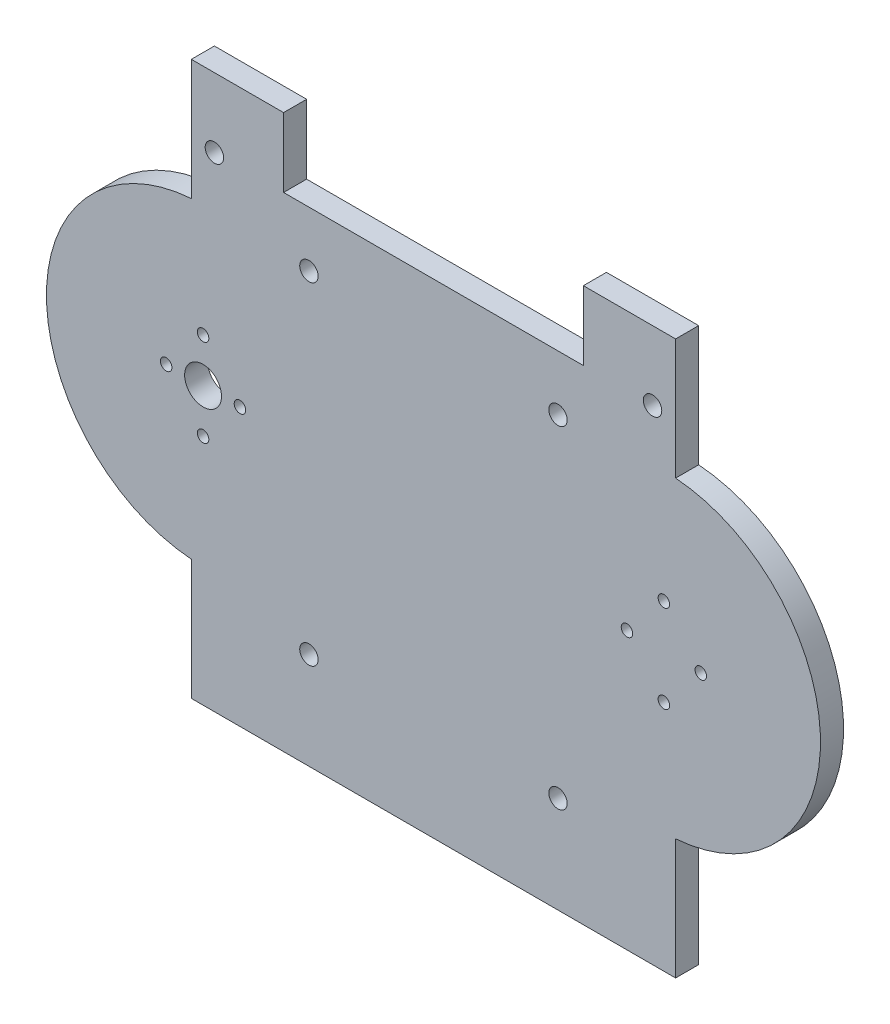
ISO-10303-21;
HEADER;
FILE_DESCRIPTION(('STEP AP214'),'2;1');
FILE_NAME('part.step','',(''),(''),'','','');
FILE_SCHEMA(('AUTOMOTIVE_DESIGN { 1 0 10303 214 1 1 1 1 }'));
ENDSEC;
DATA;
#1=APPLICATION_CONTEXT('core data for automotive mechanical design processes');
#2=APPLICATION_PROTOCOL_DEFINITION('international standard','automotive_design',2000,#1);
#3=PRODUCT_CONTEXT('',#1,'mechanical');
#4=PRODUCT('Part','Part','',(#3));
#5=PRODUCT_RELATED_PRODUCT_CATEGORY('part','',(#4));
#6=PRODUCT_DEFINITION_FORMATION('','',#4);
#7=PRODUCT_DEFINITION_CONTEXT('part definition',#1,'design');
#8=PRODUCT_DEFINITION('design','',#6,#7);
#9=PRODUCT_DEFINITION_SHAPE('','',#8);
#10=(LENGTH_UNIT() NAMED_UNIT(*) SI_UNIT(.MILLI.,.METRE.));
#11=(NAMED_UNIT(*) PLANE_ANGLE_UNIT() SI_UNIT($,.RADIAN.));
#12=(NAMED_UNIT(*) SI_UNIT($,.STERADIAN.) SOLID_ANGLE_UNIT());
#13=UNCERTAINTY_MEASURE_WITH_UNIT(LENGTH_MEASURE(1.E-05),#10,'distance_accuracy_value','');
#14=(GEOMETRIC_REPRESENTATION_CONTEXT(3) GLOBAL_UNCERTAINTY_ASSIGNED_CONTEXT((#13)) GLOBAL_UNIT_ASSIGNED_CONTEXT((#10,
#11,#12)) REPRESENTATION_CONTEXT('',''));
#15=CARTESIAN_POINT('',(0.,0.,0.));
#16=DIRECTION('',(0.,0.,1.));
#17=DIRECTION('',(1.,0.,0.));
#18=AXIS2_PLACEMENT_3D('',#15,#16,#17);
#19=CARTESIAN_POINT('',(-49.95625,0.,5.));
#20=DIRECTION('',(0.,0.,-1.));
#21=DIRECTION('',(-1.,0.,0.));
#22=AXIS2_PLACEMENT_3D('',#19,#20,#21);
#23=CYLINDRICAL_SURFACE('',#22,33.95625);
#24=CARTESIAN_POINT('',(-49.95625,0.,0.));
#25=DIRECTION('',(0.,0.,1.));
#26=DIRECTION('',(1.,0.,0.));
#27=AXIS2_PLACEMENT_3D('',#24,#25,#26);
#28=CIRCLE('',#27,33.95625);
#29=CARTESIAN_POINT('',(-52.5,33.8608365224488,0.));
#30=VERTEX_POINT('',#29);
#31=CARTESIAN_POINT('',(-52.5,-33.8608365224488,0.));
#32=VERTEX_POINT('',#31);
#33=EDGE_CURVE('E229',#30,#32,#28,.T.);
#34=ORIENTED_EDGE('',*,*,#33,.T.);
#35=DIRECTION('',(0.,0.,-1.));
#36=VECTOR('',#35,1.);
#37=CARTESIAN_POINT('',(-52.5,-33.8608365224488,5.));
#38=LINE('',#37,#36);
#39=CARTESIAN_POINT('',(-52.5,-33.8608365224488,5.));
#40=VERTEX_POINT('',#39);
#41=EDGE_CURVE('E11',#40,#32,#38,.T.);
#42=ORIENTED_EDGE('',*,*,#41,.F.);
#43=CARTESIAN_POINT('',(-49.95625,0.,5.));
#44=DIRECTION('',(0.,0.,1.));
#45=DIRECTION('',(1.,0.,0.));
#46=AXIS2_PLACEMENT_3D('',#43,#44,#45);
#47=CIRCLE('',#46,33.95625);
#48=CARTESIAN_POINT('',(-52.5,33.8608365224488,5.));
#49=VERTEX_POINT('',#48);
#50=EDGE_CURVE('E179',#49,#40,#47,.T.);
#51=ORIENTED_EDGE('',*,*,#50,.F.);
#52=DIRECTION('',(0.,0.,-1.));
#53=VECTOR('',#52,1.);
#54=CARTESIAN_POINT('',(-52.5,33.8608365224488,5.));
#55=LINE('',#54,#53);
#56=EDGE_CURVE('E194',#49,#30,#55,.T.);
#57=ORIENTED_EDGE('',*,*,#56,.T.);
#58=EDGE_LOOP('',(#34,#42,#51,#57));
#59=FACE_BOUND('',#58,.T.);
#60=ADVANCED_FACE('F41',(#59),#23,.T.);
#61=CARTESIAN_POINT('',(-52.5,0.,5.));
#62=DIRECTION('',(1.,0.,0.));
#63=DIRECTION('',(0.,1.,0.));
#64=AXIS2_PLACEMENT_3D('',#61,#62,#63);
#65=PLANE('',#64);
#66=DIRECTION('',(0.,-1.,0.));
#67=VECTOR('',#66,1.);
#68=CARTESIAN_POINT('',(-52.5,0.,0.));
#69=LINE('',#68,#67);
#70=CARTESIAN_POINT('',(-52.5,-60.,0.));
#71=VERTEX_POINT('',#70);
#72=EDGE_CURVE('E221',#32,#71,#69,.T.);
#73=ORIENTED_EDGE('',*,*,#72,.T.);
#74=DIRECTION('',(0.,0.,-1.));
#75=VECTOR('',#74,1.);
#76=CARTESIAN_POINT('',(-52.5,-60.,5.));
#77=LINE('',#76,#75);
#78=CARTESIAN_POINT('',(-52.5,-60.,5.));
#79=VERTEX_POINT('',#78);
#80=EDGE_CURVE('E49',#79,#71,#77,.T.);
#81=ORIENTED_EDGE('',*,*,#80,.F.);
#82=DIRECTION('',(0.,-1.,0.));
#83=VECTOR('',#82,1.);
#84=CARTESIAN_POINT('',(-52.5,0.,5.));
#85=LINE('',#84,#83);
#86=EDGE_CURVE('E108',#40,#79,#85,.T.);
#87=ORIENTED_EDGE('',*,*,#86,.F.);
#88=ORIENTED_EDGE('',*,*,#41,.T.);
#89=EDGE_LOOP('',(#73,#81,#87,#88));
#90=FACE_BOUND('',#89,.T.);
#91=ADVANCED_FACE('F308',(#90),#65,.F.);
#92=CARTESIAN_POINT('',(0.,-60.,5.));
#93=DIRECTION('',(0.,1.,0.));
#94=DIRECTION('',(0.,0.,1.));
#95=AXIS2_PLACEMENT_3D('',#92,#93,#94);
#96=PLANE('',#95);
#97=DIRECTION('',(1.,0.,0.));
#98=VECTOR('',#97,1.);
#99=CARTESIAN_POINT('',(0.,-60.,0.));
#100=LINE('',#99,#98);
#101=CARTESIAN_POINT('',(52.5,-60.,0.));
#102=VERTEX_POINT('',#101);
#103=EDGE_CURVE('E215',#71,#102,#100,.T.);
#104=ORIENTED_EDGE('',*,*,#103,.T.);
#105=DIRECTION('',(0.,0.,-1.));
#106=VECTOR('',#105,1.);
#107=CARTESIAN_POINT('',(52.5,-60.,5.));
#108=LINE('',#107,#106);
#109=CARTESIAN_POINT('',(52.5,-60.,5.));
#110=VERTEX_POINT('',#109);
#111=EDGE_CURVE('E209',#110,#102,#108,.T.);
#112=ORIENTED_EDGE('',*,*,#111,.F.);
#113=DIRECTION('',(1.,0.,0.));
#114=VECTOR('',#113,1.);
#115=CARTESIAN_POINT('',(0.,-60.,5.));
#116=LINE('',#115,#114);
#117=EDGE_CURVE('E174',#79,#110,#116,.T.);
#118=ORIENTED_EDGE('',*,*,#117,.F.);
#119=ORIENTED_EDGE('',*,*,#80,.T.);
#120=EDGE_LOOP('',(#104,#112,#118,#119));
#121=FACE_BOUND('',#120,.T.);
#122=ADVANCED_FACE('F214',(#121),#96,.F.);
#123=CARTESIAN_POINT('',(52.5,0.,5.));
#124=DIRECTION('',(1.,0.,0.));
#125=DIRECTION('',(0.,1.,0.));
#126=AXIS2_PLACEMENT_3D('',#123,#124,#125);
#127=PLANE('',#126);
#128=DIRECTION('',(0.,-1.,0.));
#129=VECTOR('',#128,1.);
#130=CARTESIAN_POINT('',(52.5,0.,0.));
#131=LINE('',#130,#129);
#132=CARTESIAN_POINT('',(52.5,-33.8608365224487,0.));
#133=VERTEX_POINT('',#132);
#134=EDGE_CURVE('E224',#133,#102,#131,.T.);
#135=ORIENTED_EDGE('',*,*,#134,.F.);
#136=DIRECTION('',(0.,0.,-1.));
#137=VECTOR('',#136,1.);
#138=CARTESIAN_POINT('',(52.5,-33.8608365224487,5.));
#139=LINE('',#138,#137);
#140=CARTESIAN_POINT('',(52.5,-33.8608365224487,5.));
#141=VERTEX_POINT('',#140);
#142=EDGE_CURVE('E207',#141,#133,#139,.T.);
#143=ORIENTED_EDGE('',*,*,#142,.F.);
#144=DIRECTION('',(0.,-1.,0.));
#145=VECTOR('',#144,1.);
#146=CARTESIAN_POINT('',(52.5,0.,5.));
#147=LINE('',#146,#145);
#148=EDGE_CURVE('E169',#141,#110,#147,.T.);
#149=ORIENTED_EDGE('',*,*,#148,.T.);
#150=ORIENTED_EDGE('',*,*,#111,.T.);
#151=EDGE_LOOP('',(#135,#143,#149,#150));
#152=FACE_BOUND('',#151,.T.);
#153=ADVANCED_FACE('F372',(#152),#127,.T.);
#154=CARTESIAN_POINT('',(49.95625,0.,5.));
#155=DIRECTION('',(0.,0.,-1.));
#156=DIRECTION('',(-1.,0.,0.));
#157=AXIS2_PLACEMENT_3D('',#154,#155,#156);
#158=CYLINDRICAL_SURFACE('',#157,33.95625);
#159=CARTESIAN_POINT('',(49.95625,0.,0.));
#160=DIRECTION('',(0.,0.,1.));
#161=DIRECTION('',(1.,0.,0.));
#162=AXIS2_PLACEMENT_3D('',#159,#160,#161);
#163=CIRCLE('',#162,33.95625);
#164=CARTESIAN_POINT('',(52.5,33.8608365224488,0.));
#165=VERTEX_POINT('',#164);
#166=EDGE_CURVE('E226',#133,#165,#163,.T.);
#167=ORIENTED_EDGE('',*,*,#166,.T.);
#168=DIRECTION('',(0.,0.,-1.));
#169=VECTOR('',#168,1.);
#170=CARTESIAN_POINT('',(52.5,33.8608365224488,5.));
#171=LINE('',#170,#169);
#172=CARTESIAN_POINT('',(52.5,33.8608365224488,5.));
#173=VERTEX_POINT('',#172);
#174=EDGE_CURVE('E205',#173,#165,#171,.T.);
#175=ORIENTED_EDGE('',*,*,#174,.F.);
#176=CARTESIAN_POINT('',(49.95625,0.,5.));
#177=DIRECTION('',(0.,0.,1.));
#178=DIRECTION('',(1.,0.,0.));
#179=AXIS2_PLACEMENT_3D('',#176,#177,#178);
#180=CIRCLE('',#179,33.95625);
#181=EDGE_CURVE('E167',#141,#173,#180,.T.);
#182=ORIENTED_EDGE('',*,*,#181,.F.);
#183=ORIENTED_EDGE('',*,*,#142,.T.);
#184=EDGE_LOOP('',(#167,#175,#182,#183));
#185=FACE_BOUND('',#184,.T.);
#186=ADVANCED_FACE('F374',(#185),#158,.T.);
#187=CARTESIAN_POINT('',(52.5,60.,0.));
#188=VERTEX_POINT('',#187);
#189=EDGE_CURVE('E228',#188,#165,#131,.T.);
#190=ORIENTED_EDGE('',*,*,#189,.F.);
#191=DIRECTION('',(0.,0.,-1.));
#192=VECTOR('',#191,1.);
#193=CARTESIAN_POINT('',(52.5,60.,5.));
#194=LINE('',#193,#192);
#195=CARTESIAN_POINT('',(52.5,60.,5.));
#196=VERTEX_POINT('',#195);
#197=EDGE_CURVE('E203',#196,#188,#194,.T.);
#198=ORIENTED_EDGE('',*,*,#197,.F.);
#199=EDGE_CURVE('E163',#196,#173,#147,.T.);
#200=ORIENTED_EDGE('',*,*,#199,.T.);
#201=ORIENTED_EDGE('',*,*,#174,.T.);
#202=EDGE_LOOP('',(#190,#198,#200,#201));
#203=FACE_BOUND('',#202,.T.);
#204=ADVANCED_FACE('F369',(#203),#127,.T.);
#205=CARTESIAN_POINT('',(0.,60.,5.));
#206=DIRECTION('',(0.,1.,0.));
#207=DIRECTION('',(0.,0.,1.));
#208=AXIS2_PLACEMENT_3D('',#205,#206,#207);
#209=PLANE('',#208);
#210=DIRECTION('',(1.,0.,0.));
#211=VECTOR('',#210,1.);
#212=CARTESIAN_POINT('',(0.,60.,0.));
#213=LINE('',#212,#211);
#214=CARTESIAN_POINT('',(32.5,60.,0.));
#215=VERTEX_POINT('',#214);
#216=EDGE_CURVE('E235',#215,#188,#213,.T.);
#217=ORIENTED_EDGE('',*,*,#216,.F.);
#218=DIRECTION('',(0.,0.,-1.));
#219=VECTOR('',#218,1.);
#220=CARTESIAN_POINT('',(32.5,60.,5.));
#221=LINE('',#220,#219);
#222=CARTESIAN_POINT('',(32.5,60.,5.));
#223=VERTEX_POINT('',#222);
#224=EDGE_CURVE('E201',#223,#215,#221,.T.);
#225=ORIENTED_EDGE('',*,*,#224,.F.);
#226=DIRECTION('',(1.,0.,0.));
#227=VECTOR('',#226,1.);
#228=CARTESIAN_POINT('',(0.,60.,5.));
#229=LINE('',#228,#227);
#230=EDGE_CURVE('E156',#223,#196,#229,.T.);
#231=ORIENTED_EDGE('',*,*,#230,.T.);
#232=ORIENTED_EDGE('',*,*,#197,.T.);
#233=EDGE_LOOP('',(#217,#225,#231,#232));
#234=FACE_BOUND('',#233,.T.);
#235=ADVANCED_FACE('F304',(#234),#209,.T.);
#236=CARTESIAN_POINT('',(32.5,0.,5.));
#237=DIRECTION('',(1.,0.,0.));
#238=DIRECTION('',(0.,0.,-1.));
#239=AXIS2_PLACEMENT_3D('',#236,#237,#238);
#240=PLANE('',#239);
#241=DIRECTION('',(0.,-1.,0.));
#242=VECTOR('',#241,1.);
#243=CARTESIAN_POINT('',(32.5,0.,0.));
#244=LINE('',#243,#242);
#245=CARTESIAN_POINT('',(32.5,45.,0.));
#246=VERTEX_POINT('',#245);
#247=EDGE_CURVE('E238',#215,#246,#244,.T.);
#248=ORIENTED_EDGE('',*,*,#247,.T.);
#249=DIRECTION('',(0.,0.,-1.));
#250=VECTOR('',#249,1.);
#251=CARTESIAN_POINT('',(32.5,45.,5.));
#252=LINE('',#251,#250);
#253=CARTESIAN_POINT('',(32.5,45.,5.));
#254=VERTEX_POINT('',#253);
#255=EDGE_CURVE('E199',#254,#246,#252,.T.);
#256=ORIENTED_EDGE('',*,*,#255,.F.);
#257=DIRECTION('',(0.,-1.,0.));
#258=VECTOR('',#257,1.);
#259=CARTESIAN_POINT('',(32.5,0.,5.));
#260=LINE('',#259,#258);
#261=EDGE_CURVE('E162',#223,#254,#260,.T.);
#262=ORIENTED_EDGE('',*,*,#261,.F.);
#263=ORIENTED_EDGE('',*,*,#224,.T.);
#264=EDGE_LOOP('',(#248,#256,#262,#263));
#265=FACE_BOUND('',#264,.T.);
#266=ADVANCED_FACE('F375',(#265),#240,.F.);
#267=CARTESIAN_POINT('',(0.,45.,5.));
#268=DIRECTION('',(0.,1.,0.));
#269=DIRECTION('',(0.,0.,1.));
#270=AXIS2_PLACEMENT_3D('',#267,#268,#269);
#271=PLANE('',#270);
#272=DIRECTION('',(1.,0.,0.));
#273=VECTOR('',#272,1.);
#274=CARTESIAN_POINT('',(0.,45.,0.));
#275=LINE('',#274,#273);
#276=CARTESIAN_POINT('',(-32.5,45.,0.));
#277=VERTEX_POINT('',#276);
#278=EDGE_CURVE('E242',#277,#246,#275,.T.);
#279=ORIENTED_EDGE('',*,*,#278,.F.);
#280=DIRECTION('',(0.,0.,-1.));
#281=VECTOR('',#280,1.);
#282=CARTESIAN_POINT('',(-32.5,45.,5.));
#283=LINE('',#282,#281);
#284=CARTESIAN_POINT('',(-32.5,45.,5.));
#285=VERTEX_POINT('',#284);
#286=EDGE_CURVE('E145',#285,#277,#283,.T.);
#287=ORIENTED_EDGE('',*,*,#286,.F.);
#288=DIRECTION('',(1.,0.,0.));
#289=VECTOR('',#288,1.);
#290=CARTESIAN_POINT('',(0.,45.,5.));
#291=LINE('',#290,#289);
#292=EDGE_CURVE('E152',#285,#254,#291,.T.);
#293=ORIENTED_EDGE('',*,*,#292,.T.);
#294=ORIENTED_EDGE('',*,*,#255,.T.);
#295=EDGE_LOOP('',(#279,#287,#293,#294));
#296=FACE_BOUND('',#295,.T.);
#297=ADVANCED_FACE('F361',(#296),#271,.T.);
#298=CARTESIAN_POINT('',(-32.5,0.,5.));
#299=DIRECTION('',(1.,0.,0.));
#300=DIRECTION('',(0.,0.,-1.));
#301=AXIS2_PLACEMENT_3D('',#298,#299,#300);
#302=PLANE('',#301);
#303=DIRECTION('',(0.,-1.,0.));
#304=VECTOR('',#303,1.);
#305=CARTESIAN_POINT('',(-32.5,0.,0.));
#306=LINE('',#305,#304);
#307=CARTESIAN_POINT('',(-32.5,60.,0.));
#308=VERTEX_POINT('',#307);
#309=EDGE_CURVE('E140',#308,#277,#306,.T.);
#310=ORIENTED_EDGE('',*,*,#309,.F.);
#311=DIRECTION('',(0.,0.,-1.));
#312=VECTOR('',#311,1.);
#313=CARTESIAN_POINT('',(-32.5,60.,5.));
#314=LINE('',#313,#312);
#315=CARTESIAN_POINT('',(-32.5,60.,5.));
#316=VERTEX_POINT('',#315);
#317=EDGE_CURVE('E135',#316,#308,#314,.T.);
#318=ORIENTED_EDGE('',*,*,#317,.F.);
#319=DIRECTION('',(0.,-1.,0.));
#320=VECTOR('',#319,1.);
#321=CARTESIAN_POINT('',(-32.5,0.,5.));
#322=LINE('',#321,#320);
#323=EDGE_CURVE('E138',#316,#285,#322,.T.);
#324=ORIENTED_EDGE('',*,*,#323,.T.);
#325=ORIENTED_EDGE('',*,*,#286,.T.);
#326=EDGE_LOOP('',(#310,#318,#324,#325));
#327=FACE_BOUND('',#326,.T.);
#328=ADVANCED_FACE('F137',(#327),#302,.T.);
#329=CARTESIAN_POINT('',(-52.5,60.,0.));
#330=VERTEX_POINT('',#329);
#331=EDGE_CURVE('E239',#330,#308,#213,.T.);
#332=ORIENTED_EDGE('',*,*,#331,.F.);
#333=DIRECTION('',(0.,0.,-1.));
#334=VECTOR('',#333,1.);
#335=CARTESIAN_POINT('',(-52.5,60.,5.));
#336=LINE('',#335,#334);
#337=CARTESIAN_POINT('',(-52.5,60.,5.));
#338=VERTEX_POINT('',#337);
#339=EDGE_CURVE('E97',#338,#330,#336,.T.);
#340=ORIENTED_EDGE('',*,*,#339,.F.);
#341=EDGE_CURVE('E150',#338,#316,#229,.T.);
#342=ORIENTED_EDGE('',*,*,#341,.T.);
#343=ORIENTED_EDGE('',*,*,#317,.T.);
#344=EDGE_LOOP('',(#332,#340,#342,#343));
#345=FACE_BOUND('',#344,.T.);
#346=ADVANCED_FACE('F154',(#345),#209,.T.);
#347=CARTESIAN_POINT('',(-57.95625,0.,5.));
#348=DIRECTION('',(0.,0.,-1.));
#349=DIRECTION('',(-1.,0.,0.));
#350=AXIS2_PLACEMENT_3D('',#347,#348,#349);
#351=CYLINDRICAL_SURFACE('',#350,1.25);
#352=CARTESIAN_POINT('',(-57.95625,0.,5.));
#353=DIRECTION('',(0.,0.,1.));
#354=DIRECTION('',(1.,0.,0.));
#355=AXIS2_PLACEMENT_3D('',#352,#353,#354);
#356=CIRCLE('',#355,1.25);
#357=CARTESIAN_POINT('',(-56.70625,0.,5.));
#358=VERTEX_POINT('',#357);
#359=EDGE_CURVE('E319',#358,#358,#356,.T.);
#360=ORIENTED_EDGE('',*,*,#359,.T.);
#361=EDGE_LOOP('',(#360));
#362=FACE_BOUND('',#361,.T.);
#363=CARTESIAN_POINT('',(-57.95625,0.,0.));
#364=DIRECTION('',(0.,0.,1.));
#365=DIRECTION('',(1.,0.,0.));
#366=AXIS2_PLACEMENT_3D('',#363,#364,#365);
#367=CIRCLE('',#366,1.25);
#368=CARTESIAN_POINT('',(-56.70625,0.,0.));
#369=VERTEX_POINT('',#368);
#370=EDGE_CURVE('E185',#369,#369,#367,.T.);
#371=ORIENTED_EDGE('',*,*,#370,.F.);
#372=EDGE_LOOP('',(#371));
#373=FACE_BOUND('',#372,.T.);
#374=ADVANCED_FACE('F292',(#362,#373),#351,.F.);
#375=CARTESIAN_POINT('',(41.95625,0.,5.));
#376=DIRECTION('',(0.,0.,-1.));
#377=DIRECTION('',(-1.,0.,0.));
#378=AXIS2_PLACEMENT_3D('',#375,#376,#377);
#379=CYLINDRICAL_SURFACE('',#378,1.25);
#380=CARTESIAN_POINT('',(41.95625,0.,5.));
#381=DIRECTION('',(0.,0.,1.));
#382=DIRECTION('',(1.,0.,0.));
#383=AXIS2_PLACEMENT_3D('',#380,#381,#382);
#384=CIRCLE('',#383,1.25);
#385=CARTESIAN_POINT('',(43.20625,0.,5.));
#386=VERTEX_POINT('',#385);
#387=EDGE_CURVE('E321',#386,#386,#384,.F.);
#388=ORIENTED_EDGE('',*,*,#387,.F.);
#389=EDGE_LOOP('',(#388));
#390=FACE_BOUND('',#389,.T.);
#391=CARTESIAN_POINT('',(41.95625,0.,0.));
#392=DIRECTION('',(0.,0.,1.));
#393=DIRECTION('',(1.,0.,0.));
#394=AXIS2_PLACEMENT_3D('',#391,#392,#393);
#395=CIRCLE('',#394,1.25);
#396=CARTESIAN_POINT('',(43.20625,0.,0.));
#397=VERTEX_POINT('',#396);
#398=EDGE_CURVE('E190',#397,#397,#395,.F.);
#399=ORIENTED_EDGE('',*,*,#398,.T.);
#400=EDGE_LOOP('',(#399));
#401=FACE_BOUND('',#400,.T.);
#402=ADVANCED_FACE('F284',(#390,#401),#379,.F.);
#403=CARTESIAN_POINT('',(49.95625,9.5,5.));
#404=DIRECTION('',(0.,0.,-1.));
#405=DIRECTION('',(-1.,0.,0.));
#406=AXIS2_PLACEMENT_3D('',#403,#404,#405);
#407=CYLINDRICAL_SURFACE('',#406,1.25);
#408=CARTESIAN_POINT('',(49.95625,9.5,5.));
#409=DIRECTION('',(0.,0.,1.));
#410=DIRECTION('',(1.,0.,0.));
#411=AXIS2_PLACEMENT_3D('',#408,#409,#410);
#412=CIRCLE('',#411,1.25);
#413=CARTESIAN_POINT('',(51.20625,9.5,5.));
#414=VERTEX_POINT('',#413);
#415=EDGE_CURVE('E324',#414,#414,#412,.F.);
#416=ORIENTED_EDGE('',*,*,#415,.F.);
#417=EDGE_LOOP('',(#416));
#418=FACE_BOUND('',#417,.T.);
#419=CARTESIAN_POINT('',(49.95625,9.5,0.));
#420=DIRECTION('',(0.,0.,1.));
#421=DIRECTION('',(1.,0.,0.));
#422=AXIS2_PLACEMENT_3D('',#419,#420,#421);
#423=CIRCLE('',#422,1.25);
#424=CARTESIAN_POINT('',(51.20625,9.5,0.));
#425=VERTEX_POINT('',#424);
#426=EDGE_CURVE('E279',#425,#425,#423,.F.);
#427=ORIENTED_EDGE('',*,*,#426,.T.);
#428=EDGE_LOOP('',(#427));
#429=FACE_BOUND('',#428,.T.);
#430=ADVANCED_FACE('F300',(#418,#429),#407,.F.);
#431=CARTESIAN_POINT('',(49.95625,-9.5,5.));
#432=DIRECTION('',(0.,0.,-1.));
#433=DIRECTION('',(-1.,0.,0.));
#434=AXIS2_PLACEMENT_3D('',#431,#432,#433);
#435=CYLINDRICAL_SURFACE('',#434,1.25);
#436=CARTESIAN_POINT('',(49.95625,-9.5,5.));
#437=DIRECTION('',(0.,0.,1.));
#438=DIRECTION('',(1.,0.,0.));
#439=AXIS2_PLACEMENT_3D('',#436,#437,#438);
#440=CIRCLE('',#439,1.25);
#441=CARTESIAN_POINT('',(51.20625,-9.5,5.));
#442=VERTEX_POINT('',#441);
#443=EDGE_CURVE('E327',#442,#442,#440,.F.);
#444=ORIENTED_EDGE('',*,*,#443,.F.);
#445=EDGE_LOOP('',(#444));
#446=FACE_BOUND('',#445,.T.);
#447=CARTESIAN_POINT('',(49.95625,-9.5,0.));
#448=DIRECTION('',(0.,0.,1.));
#449=DIRECTION('',(1.,0.,0.));
#450=AXIS2_PLACEMENT_3D('',#447,#448,#449);
#451=CIRCLE('',#450,1.25);
#452=CARTESIAN_POINT('',(51.20625,-9.5,0.));
#453=VERTEX_POINT('',#452);
#454=EDGE_CURVE('E276',#453,#453,#451,.F.);
#455=ORIENTED_EDGE('',*,*,#454,.T.);
#456=EDGE_LOOP('',(#455));
#457=FACE_BOUND('',#456,.T.);
#458=ADVANCED_FACE('F452',(#446,#457),#435,.F.);
#459=CARTESIAN_POINT('',(-49.95625,9.5,5.));
#460=DIRECTION('',(0.,0.,-1.));
#461=DIRECTION('',(-1.,0.,0.));
#462=AXIS2_PLACEMENT_3D('',#459,#460,#461);
#463=CYLINDRICAL_SURFACE('',#462,1.25);
#464=CARTESIAN_POINT('',(-49.95625,9.5,5.));
#465=DIRECTION('',(0.,0.,1.));
#466=DIRECTION('',(1.,0.,0.));
#467=AXIS2_PLACEMENT_3D('',#464,#465,#466);
#468=CIRCLE('',#467,1.25);
#469=CARTESIAN_POINT('',(-48.70625,9.5,5.));
#470=VERTEX_POINT('',#469);
#471=EDGE_CURVE('E330',#470,#470,#468,.T.);
#472=ORIENTED_EDGE('',*,*,#471,.T.);
#473=EDGE_LOOP('',(#472));
#474=FACE_BOUND('',#473,.T.);
#475=CARTESIAN_POINT('',(-49.95625,9.5,0.));
#476=DIRECTION('',(0.,0.,1.));
#477=DIRECTION('',(1.,0.,0.));
#478=AXIS2_PLACEMENT_3D('',#475,#476,#477);
#479=CIRCLE('',#478,1.25);
#480=CARTESIAN_POINT('',(-48.70625,9.5,0.));
#481=VERTEX_POINT('',#480);
#482=EDGE_CURVE('E273',#481,#481,#479,.T.);
#483=ORIENTED_EDGE('',*,*,#482,.F.);
#484=EDGE_LOOP('',(#483));
#485=FACE_BOUND('',#484,.T.);
#486=ADVANCED_FACE('F462',(#474,#485),#463,.F.);
#487=CARTESIAN_POINT('',(-41.95625,0.,5.));
#488=DIRECTION('',(0.,0.,-1.));
#489=DIRECTION('',(-1.,0.,0.));
#490=AXIS2_PLACEMENT_3D('',#487,#488,#489);
#491=CYLINDRICAL_SURFACE('',#490,1.25);
#492=CARTESIAN_POINT('',(-41.95625,0.,5.));
#493=DIRECTION('',(0.,0.,1.));
#494=DIRECTION('',(1.,0.,0.));
#495=AXIS2_PLACEMENT_3D('',#492,#493,#494);
#496=CIRCLE('',#495,1.25);
#497=CARTESIAN_POINT('',(-40.70625,0.,5.));
#498=VERTEX_POINT('',#497);
#499=EDGE_CURVE('E333',#498,#498,#496,.T.);
#500=ORIENTED_EDGE('',*,*,#499,.T.);
#501=EDGE_LOOP('',(#500));
#502=FACE_BOUND('',#501,.T.);
#503=CARTESIAN_POINT('',(-41.95625,0.,0.));
#504=DIRECTION('',(0.,0.,1.));
#505=DIRECTION('',(1.,0.,0.));
#506=AXIS2_PLACEMENT_3D('',#503,#504,#505);
#507=CIRCLE('',#506,1.25);
#508=CARTESIAN_POINT('',(-40.70625,0.,0.));
#509=VERTEX_POINT('',#508);
#510=EDGE_CURVE('E270',#509,#509,#507,.T.);
#511=ORIENTED_EDGE('',*,*,#510,.F.);
#512=EDGE_LOOP('',(#511));
#513=FACE_BOUND('',#512,.T.);
#514=ADVANCED_FACE('F472',(#502,#513),#491,.F.);
#515=CARTESIAN_POINT('',(-49.95625,-9.5,5.));
#516=DIRECTION('',(0.,0.,-1.));
#517=DIRECTION('',(-1.,0.,0.));
#518=AXIS2_PLACEMENT_3D('',#515,#516,#517);
#519=CYLINDRICAL_SURFACE('',#518,1.25);
#520=CARTESIAN_POINT('',(-49.95625,-9.5,5.));
#521=DIRECTION('',(0.,0.,1.));
#522=DIRECTION('',(1.,0.,0.));
#523=AXIS2_PLACEMENT_3D('',#520,#521,#522);
#524=CIRCLE('',#523,1.25);
#525=CARTESIAN_POINT('',(-48.70625,-9.5,5.));
#526=VERTEX_POINT('',#525);
#527=EDGE_CURVE('E336',#526,#526,#524,.T.);
#528=ORIENTED_EDGE('',*,*,#527,.T.);
#529=EDGE_LOOP('',(#528));
#530=FACE_BOUND('',#529,.T.);
#531=CARTESIAN_POINT('',(-49.95625,-9.5,0.));
#532=DIRECTION('',(0.,0.,1.));
#533=DIRECTION('',(1.,0.,0.));
#534=AXIS2_PLACEMENT_3D('',#531,#532,#533);
#535=CIRCLE('',#534,1.25);
#536=CARTESIAN_POINT('',(-48.70625,-9.5,0.));
#537=VERTEX_POINT('',#536);
#538=EDGE_CURVE('E267',#537,#537,#535,.T.);
#539=ORIENTED_EDGE('',*,*,#538,.F.);
#540=EDGE_LOOP('',(#539));
#541=FACE_BOUND('',#540,.T.);
#542=ADVANCED_FACE('F482',(#530,#541),#519,.F.);
#543=CARTESIAN_POINT('',(-27.,-39.,5.));
#544=DIRECTION('',(0.,0.,-1.));
#545=DIRECTION('',(-1.,0.,0.));
#546=AXIS2_PLACEMENT_3D('',#543,#544,#545);
#547=CYLINDRICAL_SURFACE('',#546,2.);
#548=CARTESIAN_POINT('',(-27.,-39.,5.));
#549=DIRECTION('',(0.,0.,1.));
#550=DIRECTION('',(1.,0.,0.));
#551=AXIS2_PLACEMENT_3D('',#548,#549,#550);
#552=CIRCLE('',#551,2.);
#553=CARTESIAN_POINT('',(-25.,-39.,5.));
#554=VERTEX_POINT('',#553);
#555=EDGE_CURVE('E339',#554,#554,#552,.T.);
#556=ORIENTED_EDGE('',*,*,#555,.T.);
#557=EDGE_LOOP('',(#556));
#558=FACE_BOUND('',#557,.T.);
#559=CARTESIAN_POINT('',(-27.,-39.,0.));
#560=DIRECTION('',(0.,0.,1.));
#561=DIRECTION('',(1.,0.,0.));
#562=AXIS2_PLACEMENT_3D('',#559,#560,#561);
#563=CIRCLE('',#562,2.);
#564=CARTESIAN_POINT('',(-25.,-39.,0.));
#565=VERTEX_POINT('',#564);
#566=EDGE_CURVE('E264',#565,#565,#563,.T.);
#567=ORIENTED_EDGE('',*,*,#566,.F.);
#568=EDGE_LOOP('',(#567));
#569=FACE_BOUND('',#568,.T.);
#570=ADVANCED_FACE('F492',(#558,#569),#547,.F.);
#571=CARTESIAN_POINT('',(27.,-39.,5.));
#572=DIRECTION('',(0.,0.,-1.));
#573=DIRECTION('',(-1.,0.,0.));
#574=AXIS2_PLACEMENT_3D('',#571,#572,#573);
#575=CYLINDRICAL_SURFACE('',#574,2.);
#576=CARTESIAN_POINT('',(27.,-39.,5.));
#577=DIRECTION('',(0.,0.,1.));
#578=DIRECTION('',(1.,0.,0.));
#579=AXIS2_PLACEMENT_3D('',#576,#577,#578);
#580=CIRCLE('',#579,2.);
#581=CARTESIAN_POINT('',(29.,-39.,5.));
#582=VERTEX_POINT('',#581);
#583=EDGE_CURVE('E342',#582,#582,#580,.T.);
#584=ORIENTED_EDGE('',*,*,#583,.T.);
#585=EDGE_LOOP('',(#584));
#586=FACE_BOUND('',#585,.T.);
#587=CARTESIAN_POINT('',(27.,-39.,0.));
#588=DIRECTION('',(0.,0.,1.));
#589=DIRECTION('',(1.,0.,0.));
#590=AXIS2_PLACEMENT_3D('',#587,#588,#589);
#591=CIRCLE('',#590,2.);
#592=CARTESIAN_POINT('',(29.,-39.,0.));
#593=VERTEX_POINT('',#592);
#594=EDGE_CURVE('E261',#593,#593,#591,.T.);
#595=ORIENTED_EDGE('',*,*,#594,.F.);
#596=EDGE_LOOP('',(#595));
#597=FACE_BOUND('',#596,.T.);
#598=ADVANCED_FACE('F502',(#586,#597),#575,.F.);
#599=CARTESIAN_POINT('',(27.,33.,5.));
#600=DIRECTION('',(0.,0.,-1.));
#601=DIRECTION('',(-1.,0.,0.));
#602=AXIS2_PLACEMENT_3D('',#599,#600,#601);
#603=CYLINDRICAL_SURFACE('',#602,2.);
#604=CARTESIAN_POINT('',(27.,33.,5.));
#605=DIRECTION('',(0.,0.,1.));
#606=DIRECTION('',(1.,0.,0.));
#607=AXIS2_PLACEMENT_3D('',#604,#605,#606);
#608=CIRCLE('',#607,2.);
#609=CARTESIAN_POINT('',(29.,33.,5.));
#610=VERTEX_POINT('',#609);
#611=EDGE_CURVE('E345',#610,#610,#608,.T.);
#612=ORIENTED_EDGE('',*,*,#611,.T.);
#613=EDGE_LOOP('',(#612));
#614=FACE_BOUND('',#613,.T.);
#615=CARTESIAN_POINT('',(27.,33.,0.));
#616=DIRECTION('',(0.,0.,1.));
#617=DIRECTION('',(1.,0.,0.));
#618=AXIS2_PLACEMENT_3D('',#615,#616,#617);
#619=CIRCLE('',#618,2.);
#620=CARTESIAN_POINT('',(29.,33.,0.));
#621=VERTEX_POINT('',#620);
#622=EDGE_CURVE('E258',#621,#621,#619,.T.);
#623=ORIENTED_EDGE('',*,*,#622,.F.);
#624=EDGE_LOOP('',(#623));
#625=FACE_BOUND('',#624,.T.);
#626=ADVANCED_FACE('F512',(#614,#625),#603,.F.);
#627=CARTESIAN_POINT('',(-27.,33.,5.));
#628=DIRECTION('',(0.,0.,-1.));
#629=DIRECTION('',(-1.,0.,0.));
#630=AXIS2_PLACEMENT_3D('',#627,#628,#629);
#631=CYLINDRICAL_SURFACE('',#630,2.);
#632=CARTESIAN_POINT('',(-27.,33.,5.));
#633=DIRECTION('',(0.,0.,1.));
#634=DIRECTION('',(1.,0.,0.));
#635=AXIS2_PLACEMENT_3D('',#632,#633,#634);
#636=CIRCLE('',#635,2.);
#637=CARTESIAN_POINT('',(-25.,33.,5.));
#638=VERTEX_POINT('',#637);
#639=EDGE_CURVE('E348',#638,#638,#636,.T.);
#640=ORIENTED_EDGE('',*,*,#639,.T.);
#641=EDGE_LOOP('',(#640));
#642=FACE_BOUND('',#641,.T.);
#643=CARTESIAN_POINT('',(-27.,33.,0.));
#644=DIRECTION('',(0.,0.,1.));
#645=DIRECTION('',(1.,0.,0.));
#646=AXIS2_PLACEMENT_3D('',#643,#644,#645);
#647=CIRCLE('',#646,2.);
#648=CARTESIAN_POINT('',(-25.,33.,0.));
#649=VERTEX_POINT('',#648);
#650=EDGE_CURVE('E255',#649,#649,#647,.T.);
#651=ORIENTED_EDGE('',*,*,#650,.F.);
#652=EDGE_LOOP('',(#651));
#653=FACE_BOUND('',#652,.T.);
#654=ADVANCED_FACE('F522',(#642,#653),#631,.F.);
#655=CARTESIAN_POINT('',(47.5,45.,5.));
#656=DIRECTION('',(0.,0.,-1.));
#657=DIRECTION('',(-1.,0.,0.));
#658=AXIS2_PLACEMENT_3D('',#655,#656,#657);
#659=CYLINDRICAL_SURFACE('',#658,2.);
#660=CARTESIAN_POINT('',(47.5,45.,5.));
#661=DIRECTION('',(0.,0.,1.));
#662=DIRECTION('',(1.,0.,0.));
#663=AXIS2_PLACEMENT_3D('',#660,#661,#662);
#664=CIRCLE('',#663,2.);
#665=CARTESIAN_POINT('',(49.5,45.,5.));
#666=VERTEX_POINT('',#665);
#667=EDGE_CURVE('E351',#666,#666,#664,.T.);
#668=ORIENTED_EDGE('',*,*,#667,.T.);
#669=EDGE_LOOP('',(#668));
#670=FACE_BOUND('',#669,.T.);
#671=CARTESIAN_POINT('',(47.5,45.,0.));
#672=DIRECTION('',(0.,0.,1.));
#673=DIRECTION('',(1.,0.,0.));
#674=AXIS2_PLACEMENT_3D('',#671,#672,#673);
#675=CIRCLE('',#674,2.);
#676=CARTESIAN_POINT('',(49.5,45.,0.));
#677=VERTEX_POINT('',#676);
#678=EDGE_CURVE('E252',#677,#677,#675,.T.);
#679=ORIENTED_EDGE('',*,*,#678,.F.);
#680=EDGE_LOOP('',(#679));
#681=FACE_BOUND('',#680,.T.);
#682=ADVANCED_FACE('F532',(#670,#681),#659,.F.);
#683=CARTESIAN_POINT('',(-47.5,45.,5.));
#684=DIRECTION('',(0.,0.,-1.));
#685=DIRECTION('',(-1.,0.,0.));
#686=AXIS2_PLACEMENT_3D('',#683,#684,#685);
#687=CYLINDRICAL_SURFACE('',#686,2.);
#688=CARTESIAN_POINT('',(-47.5,45.,5.));
#689=DIRECTION('',(0.,0.,1.));
#690=DIRECTION('',(1.,0.,0.));
#691=AXIS2_PLACEMENT_3D('',#688,#689,#690);
#692=CIRCLE('',#691,2.);
#693=CARTESIAN_POINT('',(-45.5,45.,5.));
#694=VERTEX_POINT('',#693);
#695=EDGE_CURVE('E354',#694,#694,#692,.T.);
#696=ORIENTED_EDGE('',*,*,#695,.T.);
#697=EDGE_LOOP('',(#696));
#698=FACE_BOUND('',#697,.T.);
#699=CARTESIAN_POINT('',(-47.5,45.,0.));
#700=DIRECTION('',(0.,0.,1.));
#701=DIRECTION('',(1.,0.,0.));
#702=AXIS2_PLACEMENT_3D('',#699,#700,#701);
#703=CIRCLE('',#702,2.);
#704=CARTESIAN_POINT('',(-45.5,45.,0.));
#705=VERTEX_POINT('',#704);
#706=EDGE_CURVE('E249',#705,#705,#703,.T.);
#707=ORIENTED_EDGE('',*,*,#706,.F.);
#708=EDGE_LOOP('',(#707));
#709=FACE_BOUND('',#708,.T.);
#710=ADVANCED_FACE('F542',(#698,#709),#687,.F.);
#711=CARTESIAN_POINT('',(-49.95625,0.,5.));
#712=DIRECTION('',(0.,0.,-1.));
#713=DIRECTION('',(-1.,0.,0.));
#714=AXIS2_PLACEMENT_3D('',#711,#712,#713);
#715=CYLINDRICAL_SURFACE('',#714,4.00000000000001);
#716=CARTESIAN_POINT('',(-49.95625,0.,5.));
#717=DIRECTION('',(0.,0.,1.));
#718=DIRECTION('',(1.,0.,0.));
#719=AXIS2_PLACEMENT_3D('',#716,#717,#718);
#720=CIRCLE('',#719,4.00000000000001);
#721=CARTESIAN_POINT('',(-45.95625,0.,5.));
#722=VERTEX_POINT('',#721);
#723=EDGE_CURVE('E157',#722,#722,#720,.T.);
#724=ORIENTED_EDGE('',*,*,#723,.T.);
#725=EDGE_LOOP('',(#724));
#726=FACE_BOUND('',#725,.T.);
#727=CARTESIAN_POINT('',(-49.95625,0.,0.));
#728=DIRECTION('',(0.,0.,1.));
#729=DIRECTION('',(1.,0.,0.));
#730=AXIS2_PLACEMENT_3D('',#727,#728,#729);
#731=CIRCLE('',#730,4.00000000000001);
#732=CARTESIAN_POINT('',(-45.95625,0.,0.));
#733=VERTEX_POINT('',#732);
#734=EDGE_CURVE('E246',#733,#733,#731,.T.);
#735=ORIENTED_EDGE('',*,*,#734,.F.);
#736=EDGE_LOOP('',(#735));
#737=FACE_BOUND('',#736,.T.);
#738=ADVANCED_FACE('F552',(#726,#737),#715,.F.);
#739=EDGE_CURVE('E100',#330,#30,#69,.T.);
#740=ORIENTED_EDGE('',*,*,#739,.T.);
#741=ORIENTED_EDGE('',*,*,#56,.F.);
#742=EDGE_CURVE('E57',#338,#49,#85,.T.);
#743=ORIENTED_EDGE('',*,*,#742,.F.);
#744=ORIENTED_EDGE('',*,*,#339,.T.);
#745=EDGE_LOOP('',(#740,#741,#743,#744));
#746=FACE_BOUND('',#745,.T.);
#747=ADVANCED_FACE('F314',(#746),#65,.F.);
#748=CARTESIAN_POINT('',(57.95625,0.,5.));
#749=DIRECTION('',(0.,0.,-1.));
#750=DIRECTION('',(-1.,0.,0.));
#751=AXIS2_PLACEMENT_3D('',#748,#749,#750);
#752=CYLINDRICAL_SURFACE('',#751,1.25);
#753=CARTESIAN_POINT('',(57.95625,0.,5.));
#754=DIRECTION('',(0.,0.,1.));
#755=DIRECTION('',(1.,0.,0.));
#756=AXIS2_PLACEMENT_3D('',#753,#754,#755);
#757=CIRCLE('',#756,1.25);
#758=CARTESIAN_POINT('',(59.20625,0.,5.));
#759=VERTEX_POINT('',#758);
#760=EDGE_CURVE('E196',#759,#759,#757,.F.);
#761=ORIENTED_EDGE('',*,*,#760,.F.);
#762=EDGE_LOOP('',(#761));
#763=FACE_BOUND('',#762,.T.);
#764=CARTESIAN_POINT('',(57.95625,0.,0.));
#765=DIRECTION('',(0.,0.,1.));
#766=DIRECTION('',(1.,0.,0.));
#767=AXIS2_PLACEMENT_3D('',#764,#765,#766);
#768=CIRCLE('',#767,1.25);
#769=CARTESIAN_POINT('',(59.20625,0.,0.));
#770=VERTEX_POINT('',#769);
#771=EDGE_CURVE('E181',#770,#770,#768,.F.);
#772=ORIENTED_EDGE('',*,*,#771,.T.);
#773=EDGE_LOOP('',(#772));
#774=FACE_BOUND('',#773,.T.);
#775=ADVANCED_FACE('F571',(#763,#774),#752,.F.);
#776=CARTESIAN_POINT('',(0.,0.,5.));
#777=DIRECTION('',(0.,0.,1.));
#778=DIRECTION('',(1.,0.,0.));
#779=AXIS2_PLACEMENT_3D('',#776,#777,#778);
#780=PLANE('',#779);
#781=ORIENTED_EDGE('',*,*,#50,.T.);
#782=ORIENTED_EDGE('',*,*,#86,.T.);
#783=ORIENTED_EDGE('',*,*,#117,.T.);
#784=ORIENTED_EDGE('',*,*,#148,.F.);
#785=ORIENTED_EDGE('',*,*,#181,.T.);
#786=ORIENTED_EDGE('',*,*,#199,.F.);
#787=ORIENTED_EDGE('',*,*,#230,.F.);
#788=ORIENTED_EDGE('',*,*,#261,.T.);
#789=ORIENTED_EDGE('',*,*,#292,.F.);
#790=ORIENTED_EDGE('',*,*,#323,.F.);
#791=ORIENTED_EDGE('',*,*,#341,.F.);
#792=ORIENTED_EDGE('',*,*,#742,.T.);
#793=EDGE_LOOP('',(#781,#782,#783,#784,#785,#786,#787,#788,#789,#790,#791,#792));
#794=FACE_BOUND('',#793,.T.);
#795=ORIENTED_EDGE('',*,*,#723,.F.);
#796=EDGE_LOOP('',(#795));
#797=FACE_BOUND('',#796,.T.);
#798=ORIENTED_EDGE('',*,*,#695,.F.);
#799=EDGE_LOOP('',(#798));
#800=FACE_BOUND('',#799,.T.);
#801=ORIENTED_EDGE('',*,*,#667,.F.);
#802=EDGE_LOOP('',(#801));
#803=FACE_BOUND('',#802,.T.);
#804=ORIENTED_EDGE('',*,*,#639,.F.);
#805=EDGE_LOOP('',(#804));
#806=FACE_BOUND('',#805,.T.);
#807=ORIENTED_EDGE('',*,*,#611,.F.);
#808=EDGE_LOOP('',(#807));
#809=FACE_BOUND('',#808,.T.);
#810=ORIENTED_EDGE('',*,*,#583,.F.);
#811=EDGE_LOOP('',(#810));
#812=FACE_BOUND('',#811,.T.);
#813=ORIENTED_EDGE('',*,*,#555,.F.);
#814=EDGE_LOOP('',(#813));
#815=FACE_BOUND('',#814,.T.);
#816=ORIENTED_EDGE('',*,*,#527,.F.);
#817=EDGE_LOOP('',(#816));
#818=FACE_BOUND('',#817,.T.);
#819=ORIENTED_EDGE('',*,*,#499,.F.);
#820=EDGE_LOOP('',(#819));
#821=FACE_BOUND('',#820,.T.);
#822=ORIENTED_EDGE('',*,*,#471,.F.);
#823=EDGE_LOOP('',(#822));
#824=FACE_BOUND('',#823,.T.);
#825=ORIENTED_EDGE('',*,*,#443,.T.);
#826=EDGE_LOOP('',(#825));
#827=FACE_BOUND('',#826,.T.);
#828=ORIENTED_EDGE('',*,*,#415,.T.);
#829=EDGE_LOOP('',(#828));
#830=FACE_BOUND('',#829,.T.);
#831=ORIENTED_EDGE('',*,*,#387,.T.);
#832=EDGE_LOOP('',(#831));
#833=FACE_BOUND('',#832,.T.);
#834=ORIENTED_EDGE('',*,*,#359,.F.);
#835=EDGE_LOOP('',(#834));
#836=FACE_BOUND('',#835,.T.);
#837=ORIENTED_EDGE('',*,*,#760,.T.);
#838=EDGE_LOOP('',(#837));
#839=FACE_BOUND('',#838,.T.);
#840=ADVANCED_FACE('F148',(#794,#797,#800,#803,#806,#809,#812,#815,#818,#821,#824,#827,#830,
#833,#836,#839),#780,.T.);
#841=CARTESIAN_POINT('',(0.,0.,0.));
#842=DIRECTION('',(0.,0.,1.));
#843=DIRECTION('',(1.,0.,0.));
#844=AXIS2_PLACEMENT_3D('',#841,#842,#843);
#845=PLANE('',#844);
#846=ORIENTED_EDGE('',*,*,#33,.F.);
#847=ORIENTED_EDGE('',*,*,#739,.F.);
#848=ORIENTED_EDGE('',*,*,#331,.T.);
#849=ORIENTED_EDGE('',*,*,#309,.T.);
#850=ORIENTED_EDGE('',*,*,#278,.T.);
#851=ORIENTED_EDGE('',*,*,#247,.F.);
#852=ORIENTED_EDGE('',*,*,#216,.T.);
#853=ORIENTED_EDGE('',*,*,#189,.T.);
#854=ORIENTED_EDGE('',*,*,#166,.F.);
#855=ORIENTED_EDGE('',*,*,#134,.T.);
#856=ORIENTED_EDGE('',*,*,#103,.F.);
#857=ORIENTED_EDGE('',*,*,#72,.F.);
#858=EDGE_LOOP('',(#846,#847,#848,#849,#850,#851,#852,#853,#854,#855,#856,#857));
#859=FACE_BOUND('',#858,.T.);
#860=ORIENTED_EDGE('',*,*,#734,.T.);
#861=EDGE_LOOP('',(#860));
#862=FACE_BOUND('',#861,.T.);
#863=ORIENTED_EDGE('',*,*,#706,.T.);
#864=EDGE_LOOP('',(#863));
#865=FACE_BOUND('',#864,.T.);
#866=ORIENTED_EDGE('',*,*,#678,.T.);
#867=EDGE_LOOP('',(#866));
#868=FACE_BOUND('',#867,.T.);
#869=ORIENTED_EDGE('',*,*,#650,.T.);
#870=EDGE_LOOP('',(#869));
#871=FACE_BOUND('',#870,.T.);
#872=ORIENTED_EDGE('',*,*,#622,.T.);
#873=EDGE_LOOP('',(#872));
#874=FACE_BOUND('',#873,.T.);
#875=ORIENTED_EDGE('',*,*,#594,.T.);
#876=EDGE_LOOP('',(#875));
#877=FACE_BOUND('',#876,.T.);
#878=ORIENTED_EDGE('',*,*,#566,.T.);
#879=EDGE_LOOP('',(#878));
#880=FACE_BOUND('',#879,.T.);
#881=ORIENTED_EDGE('',*,*,#538,.T.);
#882=EDGE_LOOP('',(#881));
#883=FACE_BOUND('',#882,.T.);
#884=ORIENTED_EDGE('',*,*,#510,.T.);
#885=EDGE_LOOP('',(#884));
#886=FACE_BOUND('',#885,.T.);
#887=ORIENTED_EDGE('',*,*,#482,.T.);
#888=EDGE_LOOP('',(#887));
#889=FACE_BOUND('',#888,.T.);
#890=ORIENTED_EDGE('',*,*,#454,.F.);
#891=EDGE_LOOP('',(#890));
#892=FACE_BOUND('',#891,.T.);
#893=ORIENTED_EDGE('',*,*,#426,.F.);
#894=EDGE_LOOP('',(#893));
#895=FACE_BOUND('',#894,.T.);
#896=ORIENTED_EDGE('',*,*,#398,.F.);
#897=EDGE_LOOP('',(#896));
#898=FACE_BOUND('',#897,.T.);
#899=ORIENTED_EDGE('',*,*,#370,.T.);
#900=EDGE_LOOP('',(#899));
#901=FACE_BOUND('',#900,.T.);
#902=ORIENTED_EDGE('',*,*,#771,.F.);
#903=EDGE_LOOP('',(#902));
#904=FACE_BOUND('',#903,.T.);
#905=ADVANCED_FACE('F219',(#859,#862,#865,#868,#871,#874,#877,#880,#883,#886,#889,#892,#895,
#898,#901,#904),#845,.F.);
#906=CLOSED_SHELL('',(#60,#91,#122,#153,#186,#204,#235,#266,#297,#328,#346,#374,#402,#430,#458,
#486,#514,#542,#570,#598,#626,#654,#682,#710,#738,#747,#775,#840,#905));
#907=MANIFOLD_SOLID_BREP('B2',#906);
#908=ADVANCED_BREP_SHAPE_REPRESENTATION('',(#18,#907),#14);
#909=SHAPE_DEFINITION_REPRESENTATION(#9,#908);
ENDSEC;
END-ISO-10303-21;
